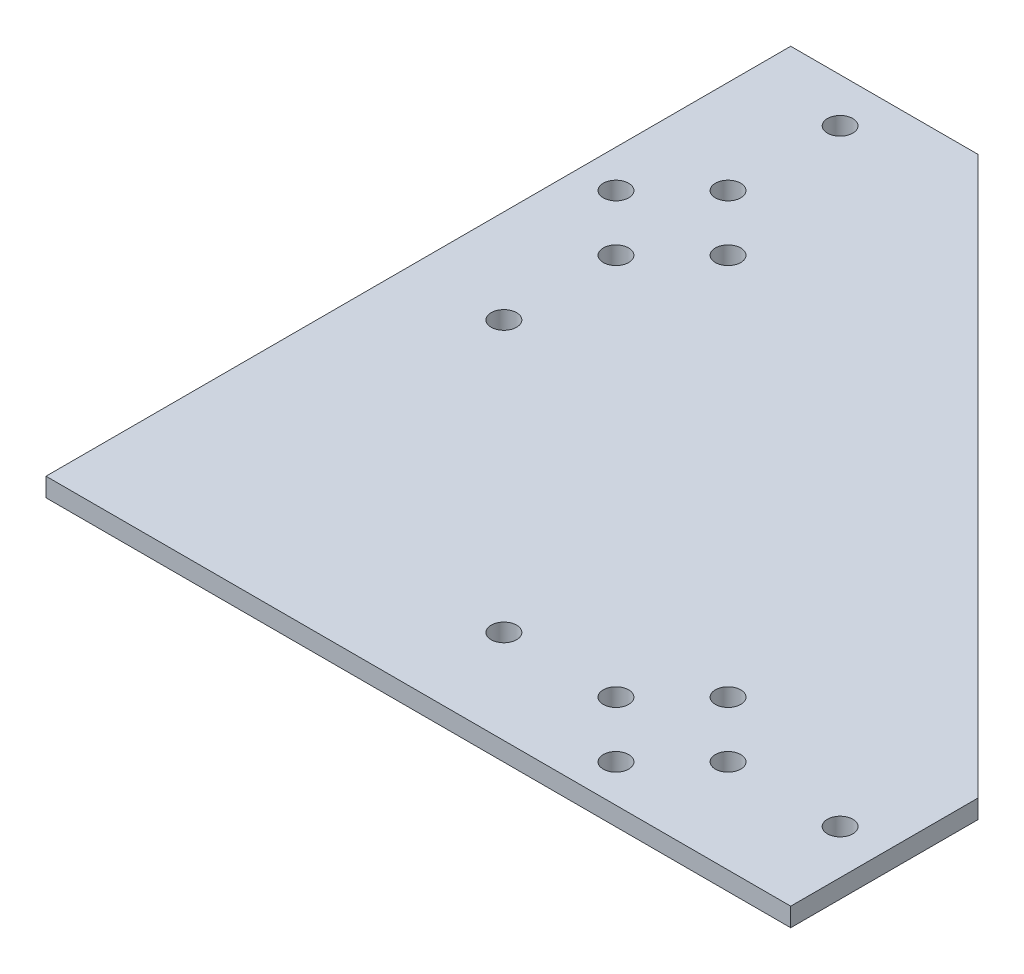
ISO-10303-21;
HEADER;
FILE_DESCRIPTION(('STEP AP214'),'2;1');
FILE_NAME('part.step','',(''),(''),'','','');
FILE_SCHEMA(('AUTOMOTIVE_DESIGN { 1 0 10303 214 1 1 1 1 }'));
ENDSEC;
DATA;
#1=APPLICATION_CONTEXT('core data for automotive mechanical design processes');
#2=APPLICATION_PROTOCOL_DEFINITION('international standard','automotive_design',2000,#1);
#3=PRODUCT_CONTEXT('',#1,'mechanical');
#4=PRODUCT('Part','Part','',(#3));
#5=PRODUCT_RELATED_PRODUCT_CATEGORY('part','',(#4));
#6=PRODUCT_DEFINITION_FORMATION('','',#4);
#7=PRODUCT_DEFINITION_CONTEXT('part definition',#1,'design');
#8=PRODUCT_DEFINITION('design','',#6,#7);
#9=PRODUCT_DEFINITION_SHAPE('','',#8);
#10=(LENGTH_UNIT() NAMED_UNIT(*) SI_UNIT(.MILLI.,.METRE.));
#11=(NAMED_UNIT(*) PLANE_ANGLE_UNIT() SI_UNIT($,.RADIAN.));
#12=(NAMED_UNIT(*) SI_UNIT($,.STERADIAN.) SOLID_ANGLE_UNIT());
#13=UNCERTAINTY_MEASURE_WITH_UNIT(LENGTH_MEASURE(1.E-05),#10,'distance_accuracy_value','');
#14=(GEOMETRIC_REPRESENTATION_CONTEXT(3) GLOBAL_UNCERTAINTY_ASSIGNED_CONTEXT((#13)) GLOBAL_UNIT_ASSIGNED_CONTEXT((#10,
#11,#12)) REPRESENTATION_CONTEXT('',''));
#15=CARTESIAN_POINT('',(0.,0.,0.));
#16=DIRECTION('',(0.,0.,1.));
#17=DIRECTION('',(1.,0.,0.));
#18=AXIS2_PLACEMENT_3D('',#15,#16,#17);
#19=CARTESIAN_POINT('',(0.,3.175,0.));
#20=DIRECTION('',(0.,0.,1.));
#21=DIRECTION('',(1.,0.,0.));
#22=AXIS2_PLACEMENT_3D('',#19,#20,#21);
#23=PLANE('',#22);
#24=DIRECTION('',(-1.,0.,0.));
#25=VECTOR('',#24,1.);
#26=CARTESIAN_POINT('',(0.,0.,0.));
#27=LINE('',#26,#25);
#28=CARTESIAN_POINT('',(126.25,0.,0.));
#29=VERTEX_POINT('',#28);
#30=CARTESIAN_POINT('',(0.,0.,0.));
#31=VERTEX_POINT('',#30);
#32=EDGE_CURVE('E106',#29,#31,#27,.T.);
#33=ORIENTED_EDGE('',*,*,#32,.F.);
#34=DIRECTION('',(0.,-1.,0.));
#35=VECTOR('',#34,1.);
#36=CARTESIAN_POINT('',(126.25,3.175,0.));
#37=LINE('',#36,#35);
#38=CARTESIAN_POINT('',(126.25,3.175,0.));
#39=VERTEX_POINT('',#38);
#40=EDGE_CURVE('E11',#39,#29,#37,.T.);
#41=ORIENTED_EDGE('',*,*,#40,.F.);
#42=DIRECTION('',(-1.,0.,0.));
#43=VECTOR('',#42,1.);
#44=CARTESIAN_POINT('',(0.,3.175,0.));
#45=LINE('',#44,#43);
#46=CARTESIAN_POINT('',(0.,3.175,0.));
#47=VERTEX_POINT('',#46);
#48=EDGE_CURVE('E118',#39,#47,#45,.T.);
#49=ORIENTED_EDGE('',*,*,#48,.T.);
#50=DIRECTION('',(0.,-1.,0.));
#51=VECTOR('',#50,1.);
#52=CARTESIAN_POINT('',(0.,3.175,0.));
#53=LINE('',#52,#51);
#54=EDGE_CURVE('E49',#47,#31,#53,.T.);
#55=ORIENTED_EDGE('',*,*,#54,.T.);
#56=EDGE_LOOP('',(#33,#41,#49,#55));
#57=FACE_BOUND('',#56,.T.);
#58=ADVANCED_FACE('F33',(#57),#23,.T.);
#59=CARTESIAN_POINT('',(126.25,3.175,0.));
#60=DIRECTION('',(1.,0.,0.));
#61=DIRECTION('',(0.,0.,-1.));
#62=AXIS2_PLACEMENT_3D('',#59,#60,#61);
#63=PLANE('',#62);
#64=DIRECTION('',(0.,0.,1.));
#65=VECTOR('',#64,1.);
#66=CARTESIAN_POINT('',(126.25,0.,0.));
#67=LINE('',#66,#65);
#68=CARTESIAN_POINT('',(126.25,0.,-31.75));
#69=VERTEX_POINT('',#68);
#70=EDGE_CURVE('E108',#69,#29,#67,.T.);
#71=ORIENTED_EDGE('',*,*,#70,.F.);
#72=DIRECTION('',(0.,-1.,0.));
#73=VECTOR('',#72,1.);
#74=CARTESIAN_POINT('',(126.25,3.175,-31.75));
#75=LINE('',#74,#73);
#76=CARTESIAN_POINT('',(126.25,3.175,-31.75));
#77=VERTEX_POINT('',#76);
#78=EDGE_CURVE('E41',#77,#69,#75,.T.);
#79=ORIENTED_EDGE('',*,*,#78,.F.);
#80=DIRECTION('',(0.,0.,1.));
#81=VECTOR('',#80,1.);
#82=CARTESIAN_POINT('',(126.25,3.175,0.));
#83=LINE('',#82,#81);
#84=EDGE_CURVE('E98',#77,#39,#83,.T.);
#85=ORIENTED_EDGE('',*,*,#84,.T.);
#86=ORIENTED_EDGE('',*,*,#40,.T.);
#87=EDGE_LOOP('',(#71,#79,#85,#86));
#88=FACE_BOUND('',#87,.T.);
#89=ADVANCED_FACE('F122',(#88),#63,.T.);
#90=CARTESIAN_POINT('',(79.,3.175,-79.));
#91=DIRECTION('',(0.707106781186548,0.,-0.707106781186548));
#92=DIRECTION('',(-0.707106781186548,0.,-0.707106781186548));
#93=AXIS2_PLACEMENT_3D('',#90,#91,#92);
#94=PLANE('',#93);
#95=DIRECTION('',(0.707106781186548,0.,0.707106781186548));
#96=VECTOR('',#95,1.);
#97=CARTESIAN_POINT('',(79.,0.,-79.));
#98=LINE('',#97,#96);
#99=CARTESIAN_POINT('',(31.75,0.,-126.25));
#100=VERTEX_POINT('',#99);
#101=EDGE_CURVE('E86',#100,#69,#98,.T.);
#102=ORIENTED_EDGE('',*,*,#101,.F.);
#103=DIRECTION('',(0.,-1.,0.));
#104=VECTOR('',#103,1.);
#105=CARTESIAN_POINT('',(31.75,3.175,-126.25));
#106=LINE('',#105,#104);
#107=CARTESIAN_POINT('',(31.75,3.175,-126.25));
#108=VERTEX_POINT('',#107);
#109=EDGE_CURVE('E81',#108,#100,#106,.T.);
#110=ORIENTED_EDGE('',*,*,#109,.F.);
#111=DIRECTION('',(0.707106781186548,0.,0.707106781186548));
#112=VECTOR('',#111,1.);
#113=CARTESIAN_POINT('',(79.,3.175,-79.));
#114=LINE('',#113,#112);
#115=EDGE_CURVE('E84',#108,#77,#114,.T.);
#116=ORIENTED_EDGE('',*,*,#115,.T.);
#117=ORIENTED_EDGE('',*,*,#78,.T.);
#118=EDGE_LOOP('',(#102,#110,#116,#117));
#119=FACE_BOUND('',#118,.T.);
#120=ADVANCED_FACE('F83',(#119),#94,.T.);
#121=CARTESIAN_POINT('',(0.,3.175,-126.25));
#122=DIRECTION('',(0.,0.,-1.));
#123=DIRECTION('',(-1.,0.,0.));
#124=AXIS2_PLACEMENT_3D('',#121,#122,#123);
#125=PLANE('',#124);
#126=DIRECTION('',(1.,0.,0.));
#127=VECTOR('',#126,1.);
#128=CARTESIAN_POINT('',(0.,0.,-126.25));
#129=LINE('',#128,#127);
#130=CARTESIAN_POINT('',(0.,0.,-126.25));
#131=VERTEX_POINT('',#130);
#132=EDGE_CURVE('E113',#131,#100,#129,.T.);
#133=ORIENTED_EDGE('',*,*,#132,.F.);
#134=DIRECTION('',(0.,-1.,0.));
#135=VECTOR('',#134,1.);
#136=CARTESIAN_POINT('',(0.,3.175,-126.25));
#137=LINE('',#136,#135);
#138=CARTESIAN_POINT('',(0.,3.175,-126.25));
#139=VERTEX_POINT('',#138);
#140=EDGE_CURVE('E65',#139,#131,#137,.T.);
#141=ORIENTED_EDGE('',*,*,#140,.F.);
#142=DIRECTION('',(1.,0.,0.));
#143=VECTOR('',#142,1.);
#144=CARTESIAN_POINT('',(0.,3.175,-126.25));
#145=LINE('',#144,#143);
#146=EDGE_CURVE('E96',#139,#108,#145,.T.);
#147=ORIENTED_EDGE('',*,*,#146,.T.);
#148=ORIENTED_EDGE('',*,*,#109,.T.);
#149=EDGE_LOOP('',(#133,#141,#147,#148));
#150=FACE_BOUND('',#149,.T.);
#151=ADVANCED_FACE('F100',(#150),#125,.T.);
#152=CARTESIAN_POINT('',(0.,3.175,0.));
#153=DIRECTION('',(-1.,0.,0.));
#154=DIRECTION('',(0.,0.,1.));
#155=AXIS2_PLACEMENT_3D('',#152,#153,#154);
#156=PLANE('',#155);
#157=DIRECTION('',(0.,0.,-1.));
#158=VECTOR('',#157,1.);
#159=CARTESIAN_POINT('',(0.,0.,0.));
#160=LINE('',#159,#158);
#161=EDGE_CURVE('E115',#31,#131,#160,.T.);
#162=ORIENTED_EDGE('',*,*,#161,.F.);
#163=ORIENTED_EDGE('',*,*,#54,.F.);
#164=DIRECTION('',(0.,0.,-1.));
#165=VECTOR('',#164,1.);
#166=CARTESIAN_POINT('',(0.,3.175,0.));
#167=LINE('',#166,#165);
#168=EDGE_CURVE('E101',#47,#139,#167,.T.);
#169=ORIENTED_EDGE('',*,*,#168,.T.);
#170=ORIENTED_EDGE('',*,*,#140,.T.);
#171=EDGE_LOOP('',(#162,#163,#169,#170));
#172=FACE_BOUND('',#171,.T.);
#173=ADVANCED_FACE('F125',(#172),#156,.T.);
#174=CARTESIAN_POINT('',(0.,3.175,0.));
#175=DIRECTION('',(0.,1.,0.));
#176=DIRECTION('',(0.,0.,1.));
#177=AXIS2_PLACEMENT_3D('',#174,#175,#176);
#178=PLANE('',#177);
#179=CARTESIAN_POINT('',(15.875,3.175,-61.75));
#180=DIRECTION('',(0.,1.,0.));
#181=DIRECTION('',(0.,0.,1.));
#182=AXIS2_PLACEMENT_3D('',#179,#180,#181);
#183=CIRCLE('',#182,2.15264999999999);
#184=CARTESIAN_POINT('',(15.875,3.175,-59.59735));
#185=VERTEX_POINT('',#184);
#186=EDGE_CURVE('E299',#185,#185,#183,.T.);
#187=ORIENTED_EDGE('',*,*,#186,.F.);
#188=EDGE_LOOP('',(#187));
#189=FACE_BOUND('',#188,.T.);
#190=CARTESIAN_POINT('',(15.875,3.175,-80.75));
#191=DIRECTION('',(0.,1.,0.));
#192=DIRECTION('',(0.,0.,1.));
#193=AXIS2_PLACEMENT_3D('',#190,#191,#192);
#194=CIRCLE('',#193,2.15264999999999);
#195=CARTESIAN_POINT('',(15.875,3.175,-78.59735));
#196=VERTEX_POINT('',#195);
#197=EDGE_CURVE('E301',#196,#196,#194,.T.);
#198=ORIENTED_EDGE('',*,*,#197,.F.);
#199=EDGE_LOOP('',(#198));
#200=FACE_BOUND('',#199,.T.);
#201=CARTESIAN_POINT('',(6.375,3.175,-90.25));
#202=DIRECTION('',(0.,1.,0.));
#203=DIRECTION('',(0.,0.,1.));
#204=AXIS2_PLACEMENT_3D('',#201,#202,#203);
#205=CIRCLE('',#204,2.15264999999999);
#206=CARTESIAN_POINT('',(6.375,3.175,-88.09735));
#207=VERTEX_POINT('',#206);
#208=EDGE_CURVE('E309',#207,#207,#205,.T.);
#209=ORIENTED_EDGE('',*,*,#208,.F.);
#210=EDGE_LOOP('',(#209));
#211=FACE_BOUND('',#210,.T.);
#212=CARTESIAN_POINT('',(25.375,3.175,-90.25));
#213=DIRECTION('',(0.,1.,0.));
#214=DIRECTION('',(0.,0.,1.));
#215=AXIS2_PLACEMENT_3D('',#212,#213,#214);
#216=CIRCLE('',#215,2.15264999999999);
#217=CARTESIAN_POINT('',(25.375,3.175,-88.09735));
#218=VERTEX_POINT('',#217);
#219=EDGE_CURVE('E315',#218,#218,#216,.T.);
#220=ORIENTED_EDGE('',*,*,#219,.F.);
#221=EDGE_LOOP('',(#220));
#222=FACE_BOUND('',#221,.T.);
#223=CARTESIAN_POINT('',(15.875,3.175,-99.75));
#224=DIRECTION('',(0.,1.,0.));
#225=DIRECTION('',(0.,0.,1.));
#226=AXIS2_PLACEMENT_3D('',#223,#224,#225);
#227=CIRCLE('',#226,2.15264999999999);
#228=CARTESIAN_POINT('',(15.875,3.175,-97.59735));
#229=VERTEX_POINT('',#228);
#230=EDGE_CURVE('E321',#229,#229,#227,.T.);
#231=ORIENTED_EDGE('',*,*,#230,.F.);
#232=EDGE_LOOP('',(#231));
#233=FACE_BOUND('',#232,.T.);
#234=CARTESIAN_POINT('',(15.875,3.175,-118.75));
#235=DIRECTION('',(0.,1.,0.));
#236=DIRECTION('',(0.,0.,1.));
#237=AXIS2_PLACEMENT_3D('',#234,#235,#236);
#238=CIRCLE('',#237,2.15264999999999);
#239=CARTESIAN_POINT('',(15.875,3.175,-116.59735));
#240=VERTEX_POINT('',#239);
#241=EDGE_CURVE('E327',#240,#240,#238,.T.);
#242=ORIENTED_EDGE('',*,*,#241,.F.);
#243=EDGE_LOOP('',(#242));
#244=FACE_BOUND('',#243,.T.);
#245=CARTESIAN_POINT('',(118.75,3.175,-15.875));
#246=DIRECTION('',(0.,1.,0.));
#247=DIRECTION('',(0.,0.,1.));
#248=AXIS2_PLACEMENT_3D('',#245,#246,#247);
#249=CIRCLE('',#248,2.15264999999999);
#250=CARTESIAN_POINT('',(118.75,3.175,-13.72235));
#251=VERTEX_POINT('',#250);
#252=EDGE_CURVE('E333',#251,#251,#249,.T.);
#253=ORIENTED_EDGE('',*,*,#252,.F.);
#254=EDGE_LOOP('',(#253));
#255=FACE_BOUND('',#254,.T.);
#256=CARTESIAN_POINT('',(99.75,3.175,-15.875));
#257=DIRECTION('',(0.,1.,0.));
#258=DIRECTION('',(0.,0.,1.));
#259=AXIS2_PLACEMENT_3D('',#256,#257,#258);
#260=CIRCLE('',#259,2.15264999999999);
#261=CARTESIAN_POINT('',(99.75,3.175,-13.72235));
#262=VERTEX_POINT('',#261);
#263=EDGE_CURVE('E339',#262,#262,#260,.T.);
#264=ORIENTED_EDGE('',*,*,#263,.F.);
#265=EDGE_LOOP('',(#264));
#266=FACE_BOUND('',#265,.T.);
#267=CARTESIAN_POINT('',(90.25,3.175,-25.375));
#268=DIRECTION('',(0.,1.,0.));
#269=DIRECTION('',(0.,0.,1.));
#270=AXIS2_PLACEMENT_3D('',#267,#268,#269);
#271=CIRCLE('',#270,2.15264999999999);
#272=CARTESIAN_POINT('',(90.25,3.175,-23.22235));
#273=VERTEX_POINT('',#272);
#274=EDGE_CURVE('E345',#273,#273,#271,.T.);
#275=ORIENTED_EDGE('',*,*,#274,.F.);
#276=EDGE_LOOP('',(#275));
#277=FACE_BOUND('',#276,.T.);
#278=CARTESIAN_POINT('',(90.25,3.175,-6.37500000000001));
#279=DIRECTION('',(0.,1.,0.));
#280=DIRECTION('',(0.,0.,1.));
#281=AXIS2_PLACEMENT_3D('',#278,#279,#280);
#282=CIRCLE('',#281,2.15264999999999);
#283=CARTESIAN_POINT('',(90.25,3.175,-4.22235000000001));
#284=VERTEX_POINT('',#283);
#285=EDGE_CURVE('E351',#284,#284,#282,.T.);
#286=ORIENTED_EDGE('',*,*,#285,.F.);
#287=EDGE_LOOP('',(#286));
#288=FACE_BOUND('',#287,.T.);
#289=CARTESIAN_POINT('',(80.75,3.175,-15.875));
#290=DIRECTION('',(0.,1.,0.));
#291=DIRECTION('',(0.,0.,1.));
#292=AXIS2_PLACEMENT_3D('',#289,#290,#291);
#293=CIRCLE('',#292,2.15264999999999);
#294=CARTESIAN_POINT('',(80.75,3.175,-13.72235));
#295=VERTEX_POINT('',#294);
#296=EDGE_CURVE('E357',#295,#295,#293,.T.);
#297=ORIENTED_EDGE('',*,*,#296,.F.);
#298=EDGE_LOOP('',(#297));
#299=FACE_BOUND('',#298,.T.);
#300=CARTESIAN_POINT('',(61.75,3.175,-15.875));
#301=DIRECTION('',(0.,1.,0.));
#302=DIRECTION('',(0.,0.,1.));
#303=AXIS2_PLACEMENT_3D('',#300,#301,#302);
#304=CIRCLE('',#303,2.15264999999999);
#305=CARTESIAN_POINT('',(61.75,3.175,-13.72235));
#306=VERTEX_POINT('',#305);
#307=EDGE_CURVE('E363',#306,#306,#304,.T.);
#308=ORIENTED_EDGE('',*,*,#307,.F.);
#309=EDGE_LOOP('',(#308));
#310=FACE_BOUND('',#309,.T.);
#311=ORIENTED_EDGE('',*,*,#48,.F.);
#312=ORIENTED_EDGE('',*,*,#84,.F.);
#313=ORIENTED_EDGE('',*,*,#115,.F.);
#314=ORIENTED_EDGE('',*,*,#146,.F.);
#315=ORIENTED_EDGE('',*,*,#168,.F.);
#316=EDGE_LOOP('',(#311,#312,#313,#314,#315));
#317=FACE_BOUND('',#316,.T.);
#318=ADVANCED_FACE('F94',(#189,#200,#211,#222,#233,#244,#255,#266,#277,#288,#299,#310,#317),
#178,.T.);
#319=CARTESIAN_POINT('',(0.,0.,0.));
#320=DIRECTION('',(0.,1.,0.));
#321=DIRECTION('',(0.,0.,1.));
#322=AXIS2_PLACEMENT_3D('',#319,#320,#321);
#323=PLANE('',#322);
#324=CARTESIAN_POINT('',(15.875,0.,-61.75));
#325=DIRECTION('',(0.,1.,0.));
#326=DIRECTION('',(0.,0.,1.));
#327=AXIS2_PLACEMENT_3D('',#324,#325,#326);
#328=CIRCLE('',#327,2.15264999999999);
#329=CARTESIAN_POINT('',(15.875,0.,-59.59735));
#330=VERTEX_POINT('',#329);
#331=EDGE_CURVE('E296',#330,#330,#328,.T.);
#332=ORIENTED_EDGE('',*,*,#331,.T.);
#333=EDGE_LOOP('',(#332));
#334=FACE_BOUND('',#333,.T.);
#335=CARTESIAN_POINT('',(15.875,0.,-80.75));
#336=DIRECTION('',(0.,1.,0.));
#337=DIRECTION('',(0.,0.,1.));
#338=AXIS2_PLACEMENT_3D('',#335,#336,#337);
#339=CIRCLE('',#338,2.15264999999999);
#340=CARTESIAN_POINT('',(15.875,0.,-78.59735));
#341=VERTEX_POINT('',#340);
#342=EDGE_CURVE('E306',#341,#341,#339,.T.);
#343=ORIENTED_EDGE('',*,*,#342,.T.);
#344=EDGE_LOOP('',(#343));
#345=FACE_BOUND('',#344,.T.);
#346=CARTESIAN_POINT('',(6.375,0.,-90.25));
#347=DIRECTION('',(0.,1.,0.));
#348=DIRECTION('',(0.,0.,1.));
#349=AXIS2_PLACEMENT_3D('',#346,#347,#348);
#350=CIRCLE('',#349,2.15264999999999);
#351=CARTESIAN_POINT('',(6.375,0.,-88.09735));
#352=VERTEX_POINT('',#351);
#353=EDGE_CURVE('E312',#352,#352,#350,.T.);
#354=ORIENTED_EDGE('',*,*,#353,.T.);
#355=EDGE_LOOP('',(#354));
#356=FACE_BOUND('',#355,.T.);
#357=CARTESIAN_POINT('',(25.375,0.,-90.25));
#358=DIRECTION('',(0.,1.,0.));
#359=DIRECTION('',(0.,0.,1.));
#360=AXIS2_PLACEMENT_3D('',#357,#358,#359);
#361=CIRCLE('',#360,2.15264999999999);
#362=CARTESIAN_POINT('',(25.375,0.,-88.09735));
#363=VERTEX_POINT('',#362);
#364=EDGE_CURVE('E318',#363,#363,#361,.T.);
#365=ORIENTED_EDGE('',*,*,#364,.T.);
#366=EDGE_LOOP('',(#365));
#367=FACE_BOUND('',#366,.T.);
#368=CARTESIAN_POINT('',(15.875,0.,-99.75));
#369=DIRECTION('',(0.,1.,0.));
#370=DIRECTION('',(0.,0.,1.));
#371=AXIS2_PLACEMENT_3D('',#368,#369,#370);
#372=CIRCLE('',#371,2.15264999999999);
#373=CARTESIAN_POINT('',(15.875,0.,-97.59735));
#374=VERTEX_POINT('',#373);
#375=EDGE_CURVE('E324',#374,#374,#372,.T.);
#376=ORIENTED_EDGE('',*,*,#375,.T.);
#377=EDGE_LOOP('',(#376));
#378=FACE_BOUND('',#377,.T.);
#379=CARTESIAN_POINT('',(15.875,0.,-118.75));
#380=DIRECTION('',(0.,1.,0.));
#381=DIRECTION('',(0.,0.,1.));
#382=AXIS2_PLACEMENT_3D('',#379,#380,#381);
#383=CIRCLE('',#382,2.15264999999999);
#384=CARTESIAN_POINT('',(15.875,0.,-116.59735));
#385=VERTEX_POINT('',#384);
#386=EDGE_CURVE('E330',#385,#385,#383,.T.);
#387=ORIENTED_EDGE('',*,*,#386,.T.);
#388=EDGE_LOOP('',(#387));
#389=FACE_BOUND('',#388,.T.);
#390=CARTESIAN_POINT('',(118.75,0.,-15.875));
#391=DIRECTION('',(0.,1.,0.));
#392=DIRECTION('',(0.,0.,1.));
#393=AXIS2_PLACEMENT_3D('',#390,#391,#392);
#394=CIRCLE('',#393,2.15264999999999);
#395=CARTESIAN_POINT('',(118.75,0.,-13.72235));
#396=VERTEX_POINT('',#395);
#397=EDGE_CURVE('E336',#396,#396,#394,.T.);
#398=ORIENTED_EDGE('',*,*,#397,.T.);
#399=EDGE_LOOP('',(#398));
#400=FACE_BOUND('',#399,.T.);
#401=CARTESIAN_POINT('',(99.75,0.,-15.875));
#402=DIRECTION('',(0.,1.,0.));
#403=DIRECTION('',(0.,0.,1.));
#404=AXIS2_PLACEMENT_3D('',#401,#402,#403);
#405=CIRCLE('',#404,2.15264999999999);
#406=CARTESIAN_POINT('',(99.75,0.,-13.72235));
#407=VERTEX_POINT('',#406);
#408=EDGE_CURVE('E342',#407,#407,#405,.T.);
#409=ORIENTED_EDGE('',*,*,#408,.T.);
#410=EDGE_LOOP('',(#409));
#411=FACE_BOUND('',#410,.T.);
#412=CARTESIAN_POINT('',(90.25,0.,-25.375));
#413=DIRECTION('',(0.,1.,0.));
#414=DIRECTION('',(0.,0.,1.));
#415=AXIS2_PLACEMENT_3D('',#412,#413,#414);
#416=CIRCLE('',#415,2.15264999999999);
#417=CARTESIAN_POINT('',(90.25,0.,-23.22235));
#418=VERTEX_POINT('',#417);
#419=EDGE_CURVE('E348',#418,#418,#416,.T.);
#420=ORIENTED_EDGE('',*,*,#419,.T.);
#421=EDGE_LOOP('',(#420));
#422=FACE_BOUND('',#421,.T.);
#423=CARTESIAN_POINT('',(90.25,0.,-6.37500000000001));
#424=DIRECTION('',(0.,1.,0.));
#425=DIRECTION('',(0.,0.,1.));
#426=AXIS2_PLACEMENT_3D('',#423,#424,#425);
#427=CIRCLE('',#426,2.15264999999999);
#428=CARTESIAN_POINT('',(90.25,0.,-4.22235000000001));
#429=VERTEX_POINT('',#428);
#430=EDGE_CURVE('E354',#429,#429,#427,.T.);
#431=ORIENTED_EDGE('',*,*,#430,.T.);
#432=EDGE_LOOP('',(#431));
#433=FACE_BOUND('',#432,.T.);
#434=CARTESIAN_POINT('',(80.75,0.,-15.875));
#435=DIRECTION('',(0.,1.,0.));
#436=DIRECTION('',(0.,0.,1.));
#437=AXIS2_PLACEMENT_3D('',#434,#435,#436);
#438=CIRCLE('',#437,2.15264999999999);
#439=CARTESIAN_POINT('',(80.75,0.,-13.72235));
#440=VERTEX_POINT('',#439);
#441=EDGE_CURVE('E360',#440,#440,#438,.T.);
#442=ORIENTED_EDGE('',*,*,#441,.T.);
#443=EDGE_LOOP('',(#442));
#444=FACE_BOUND('',#443,.T.);
#445=CARTESIAN_POINT('',(61.75,0.,-15.875));
#446=DIRECTION('',(0.,1.,0.));
#447=DIRECTION('',(0.,0.,1.));
#448=AXIS2_PLACEMENT_3D('',#445,#446,#447);
#449=CIRCLE('',#448,2.15264999999999);
#450=CARTESIAN_POINT('',(61.75,0.,-13.72235));
#451=VERTEX_POINT('',#450);
#452=EDGE_CURVE('E109',#451,#451,#449,.T.);
#453=ORIENTED_EDGE('',*,*,#452,.T.);
#454=EDGE_LOOP('',(#453));
#455=FACE_BOUND('',#454,.T.);
#456=ORIENTED_EDGE('',*,*,#32,.T.);
#457=ORIENTED_EDGE('',*,*,#161,.T.);
#458=ORIENTED_EDGE('',*,*,#132,.T.);
#459=ORIENTED_EDGE('',*,*,#101,.T.);
#460=ORIENTED_EDGE('',*,*,#70,.T.);
#461=EDGE_LOOP('',(#456,#457,#458,#459,#460));
#462=FACE_BOUND('',#461,.T.);
#463=ADVANCED_FACE('F124',(#334,#345,#356,#367,#378,#389,#400,#411,#422,#433,#444,#455,#462),
#323,.F.);
#464=CARTESIAN_POINT('',(61.75,3.175,-15.875));
#465=DIRECTION('',(0.,1.,0.));
#466=DIRECTION('',(0.,0.,1.));
#467=AXIS2_PLACEMENT_3D('',#464,#465,#466);
#468=CYLINDRICAL_SURFACE('',#467,2.15264999999999);
#469=ORIENTED_EDGE('',*,*,#452,.F.);
#470=EDGE_LOOP('',(#469));
#471=FACE_BOUND('',#470,.T.);
#472=ORIENTED_EDGE('',*,*,#307,.T.);
#473=EDGE_LOOP('',(#472));
#474=FACE_BOUND('',#473,.T.);
#475=ADVANCED_FACE('F170',(#471,#474),#468,.F.);
#476=CARTESIAN_POINT('',(80.75,3.175,-15.875));
#477=DIRECTION('',(0.,1.,0.));
#478=DIRECTION('',(0.,0.,1.));
#479=AXIS2_PLACEMENT_3D('',#476,#477,#478);
#480=CYLINDRICAL_SURFACE('',#479,2.15264999999999);
#481=ORIENTED_EDGE('',*,*,#441,.F.);
#482=EDGE_LOOP('',(#481));
#483=FACE_BOUND('',#482,.T.);
#484=ORIENTED_EDGE('',*,*,#296,.T.);
#485=EDGE_LOOP('',(#484));
#486=FACE_BOUND('',#485,.T.);
#487=ADVANCED_FACE('F179',(#483,#486),#480,.F.);
#488=CARTESIAN_POINT('',(90.25,3.175,-6.37500000000001));
#489=DIRECTION('',(0.,1.,0.));
#490=DIRECTION('',(0.,0.,1.));
#491=AXIS2_PLACEMENT_3D('',#488,#489,#490);
#492=CYLINDRICAL_SURFACE('',#491,2.15264999999999);
#493=ORIENTED_EDGE('',*,*,#430,.F.);
#494=EDGE_LOOP('',(#493));
#495=FACE_BOUND('',#494,.T.);
#496=ORIENTED_EDGE('',*,*,#285,.T.);
#497=EDGE_LOOP('',(#496));
#498=FACE_BOUND('',#497,.T.);
#499=ADVANCED_FACE('F189',(#495,#498),#492,.F.);
#500=CARTESIAN_POINT('',(90.25,3.175,-25.375));
#501=DIRECTION('',(0.,1.,0.));
#502=DIRECTION('',(0.,0.,1.));
#503=AXIS2_PLACEMENT_3D('',#500,#501,#502);
#504=CYLINDRICAL_SURFACE('',#503,2.15264999999999);
#505=ORIENTED_EDGE('',*,*,#419,.F.);
#506=EDGE_LOOP('',(#505));
#507=FACE_BOUND('',#506,.T.);
#508=ORIENTED_EDGE('',*,*,#274,.T.);
#509=EDGE_LOOP('',(#508));
#510=FACE_BOUND('',#509,.T.);
#511=ADVANCED_FACE('F199',(#507,#510),#504,.F.);
#512=CARTESIAN_POINT('',(99.75,3.175,-15.875));
#513=DIRECTION('',(0.,1.,0.));
#514=DIRECTION('',(0.,0.,1.));
#515=AXIS2_PLACEMENT_3D('',#512,#513,#514);
#516=CYLINDRICAL_SURFACE('',#515,2.15264999999999);
#517=ORIENTED_EDGE('',*,*,#408,.F.);
#518=EDGE_LOOP('',(#517));
#519=FACE_BOUND('',#518,.T.);
#520=ORIENTED_EDGE('',*,*,#263,.T.);
#521=EDGE_LOOP('',(#520));
#522=FACE_BOUND('',#521,.T.);
#523=ADVANCED_FACE('F209',(#519,#522),#516,.F.);
#524=CARTESIAN_POINT('',(118.75,3.175,-15.875));
#525=DIRECTION('',(0.,1.,0.));
#526=DIRECTION('',(0.,0.,1.));
#527=AXIS2_PLACEMENT_3D('',#524,#525,#526);
#528=CYLINDRICAL_SURFACE('',#527,2.15264999999999);
#529=ORIENTED_EDGE('',*,*,#397,.F.);
#530=EDGE_LOOP('',(#529));
#531=FACE_BOUND('',#530,.T.);
#532=ORIENTED_EDGE('',*,*,#252,.T.);
#533=EDGE_LOOP('',(#532));
#534=FACE_BOUND('',#533,.T.);
#535=ADVANCED_FACE('F219',(#531,#534),#528,.F.);
#536=CARTESIAN_POINT('',(15.875,3.175,-118.75));
#537=DIRECTION('',(0.,1.,0.));
#538=DIRECTION('',(0.,0.,1.));
#539=AXIS2_PLACEMENT_3D('',#536,#537,#538);
#540=CYLINDRICAL_SURFACE('',#539,2.15264999999999);
#541=ORIENTED_EDGE('',*,*,#386,.F.);
#542=EDGE_LOOP('',(#541));
#543=FACE_BOUND('',#542,.T.);
#544=ORIENTED_EDGE('',*,*,#241,.T.);
#545=EDGE_LOOP('',(#544));
#546=FACE_BOUND('',#545,.T.);
#547=ADVANCED_FACE('F229',(#543,#546),#540,.F.);
#548=CARTESIAN_POINT('',(15.875,3.175,-99.75));
#549=DIRECTION('',(0.,1.,0.));
#550=DIRECTION('',(0.,0.,1.));
#551=AXIS2_PLACEMENT_3D('',#548,#549,#550);
#552=CYLINDRICAL_SURFACE('',#551,2.15264999999999);
#553=ORIENTED_EDGE('',*,*,#375,.F.);
#554=EDGE_LOOP('',(#553));
#555=FACE_BOUND('',#554,.T.);
#556=ORIENTED_EDGE('',*,*,#230,.T.);
#557=EDGE_LOOP('',(#556));
#558=FACE_BOUND('',#557,.T.);
#559=ADVANCED_FACE('F239',(#555,#558),#552,.F.);
#560=CARTESIAN_POINT('',(25.375,3.175,-90.25));
#561=DIRECTION('',(0.,1.,0.));
#562=DIRECTION('',(0.,0.,1.));
#563=AXIS2_PLACEMENT_3D('',#560,#561,#562);
#564=CYLINDRICAL_SURFACE('',#563,2.15264999999999);
#565=ORIENTED_EDGE('',*,*,#364,.F.);
#566=EDGE_LOOP('',(#565));
#567=FACE_BOUND('',#566,.T.);
#568=ORIENTED_EDGE('',*,*,#219,.T.);
#569=EDGE_LOOP('',(#568));
#570=FACE_BOUND('',#569,.T.);
#571=ADVANCED_FACE('F249',(#567,#570),#564,.F.);
#572=CARTESIAN_POINT('',(6.375,3.175,-90.25));
#573=DIRECTION('',(0.,1.,0.));
#574=DIRECTION('',(0.,0.,1.));
#575=AXIS2_PLACEMENT_3D('',#572,#573,#574);
#576=CYLINDRICAL_SURFACE('',#575,2.15264999999999);
#577=ORIENTED_EDGE('',*,*,#353,.F.);
#578=EDGE_LOOP('',(#577));
#579=FACE_BOUND('',#578,.T.);
#580=ORIENTED_EDGE('',*,*,#208,.T.);
#581=EDGE_LOOP('',(#580));
#582=FACE_BOUND('',#581,.T.);
#583=ADVANCED_FACE('F259',(#579,#582),#576,.F.);
#584=CARTESIAN_POINT('',(15.875,3.175,-80.75));
#585=DIRECTION('',(0.,1.,0.));
#586=DIRECTION('',(0.,0.,1.));
#587=AXIS2_PLACEMENT_3D('',#584,#585,#586);
#588=CYLINDRICAL_SURFACE('',#587,2.15264999999999);
#589=ORIENTED_EDGE('',*,*,#342,.F.);
#590=EDGE_LOOP('',(#589));
#591=FACE_BOUND('',#590,.T.);
#592=ORIENTED_EDGE('',*,*,#197,.T.);
#593=EDGE_LOOP('',(#592));
#594=FACE_BOUND('',#593,.T.);
#595=ADVANCED_FACE('F269',(#591,#594),#588,.F.);
#596=CARTESIAN_POINT('',(15.875,3.175,-61.75));
#597=DIRECTION('',(0.,1.,0.));
#598=DIRECTION('',(0.,0.,1.));
#599=AXIS2_PLACEMENT_3D('',#596,#597,#598);
#600=CYLINDRICAL_SURFACE('',#599,2.15264999999999);
#601=ORIENTED_EDGE('',*,*,#331,.F.);
#602=EDGE_LOOP('',(#601));
#603=FACE_BOUND('',#602,.T.);
#604=ORIENTED_EDGE('',*,*,#186,.T.);
#605=EDGE_LOOP('',(#604));
#606=FACE_BOUND('',#605,.T.);
#607=ADVANCED_FACE('F279',(#603,#606),#600,.F.);
#608=CLOSED_SHELL('',(#58,#89,#120,#151,#173,#318,#463,#475,#487,#499,#511,#523,#535,#547,#559,
#571,#583,#595,#607));
#609=MANIFOLD_SOLID_BREP('B2',#608);
#610=ADVANCED_BREP_SHAPE_REPRESENTATION('',(#18,#609),#14);
#611=SHAPE_DEFINITION_REPRESENTATION(#9,#610);
ENDSEC;
END-ISO-10303-21;
